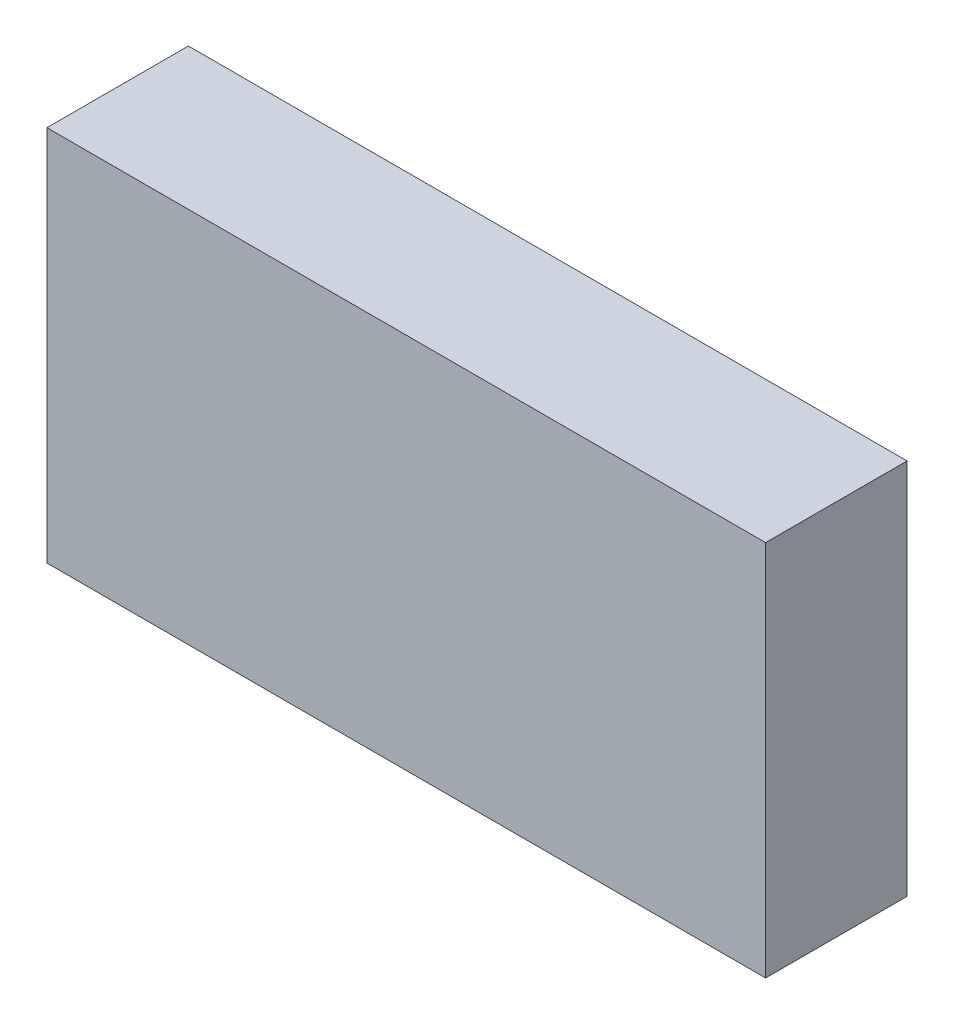
ISO-10303-21;
HEADER;
FILE_DESCRIPTION(('STEP AP214'),'2;1');
FILE_NAME('part.step','',(''),(''),'','','');
FILE_SCHEMA(('AUTOMOTIVE_DESIGN { 1 0 10303 214 1 1 1 1 }'));
ENDSEC;
DATA;
#1=APPLICATION_CONTEXT('core data for automotive mechanical design processes');
#2=APPLICATION_PROTOCOL_DEFINITION('international standard','automotive_design',2000,#1);
#3=PRODUCT_CONTEXT('',#1,'mechanical');
#4=PRODUCT('Part','Part','',(#3));
#5=PRODUCT_RELATED_PRODUCT_CATEGORY('part','',(#4));
#6=PRODUCT_DEFINITION_FORMATION('','',#4);
#7=PRODUCT_DEFINITION_CONTEXT('part definition',#1,'design');
#8=PRODUCT_DEFINITION('design','',#6,#7);
#9=PRODUCT_DEFINITION_SHAPE('','',#8);
#10=(LENGTH_UNIT() NAMED_UNIT(*) SI_UNIT(.MILLI.,.METRE.));
#11=(NAMED_UNIT(*) PLANE_ANGLE_UNIT() SI_UNIT($,.RADIAN.));
#12=(NAMED_UNIT(*) SI_UNIT($,.STERADIAN.) SOLID_ANGLE_UNIT());
#13=UNCERTAINTY_MEASURE_WITH_UNIT(LENGTH_MEASURE(1.E-05),#10,'distance_accuracy_value','');
#14=(GEOMETRIC_REPRESENTATION_CONTEXT(3) GLOBAL_UNCERTAINTY_ASSIGNED_CONTEXT((#13)) GLOBAL_UNIT_ASSIGNED_CONTEXT((#10,
#11,#12)) REPRESENTATION_CONTEXT('',''));
#15=CARTESIAN_POINT('',(0.,0.,0.));
#16=DIRECTION('',(0.,0.,1.));
#17=DIRECTION('',(1.,0.,0.));
#18=AXIS2_PLACEMENT_3D('',#15,#16,#17);
#19=CARTESIAN_POINT('',(0.,0.,20.));
#20=DIRECTION('',(1.,0.,0.));
#21=DIRECTION('',(0.,0.,-1.));
#22=AXIS2_PLACEMENT_3D('',#19,#20,#21);
#23=PLANE('',#22);
#24=DIRECTION('',(0.,-1.,0.));
#25=VECTOR('',#24,1.);
#26=CARTESIAN_POINT('',(0.,0.,0.));
#27=LINE('',#26,#25);
#28=CARTESIAN_POINT('',(0.,53.3,0.));
#29=VERTEX_POINT('',#28);
#30=CARTESIAN_POINT('',(0.,0.,0.));
#31=VERTEX_POINT('',#30);
#32=EDGE_CURVE('E97',#29,#31,#27,.T.);
#33=ORIENTED_EDGE('',*,*,#32,.T.);
#34=DIRECTION('',(0.,0.,-1.));
#35=VECTOR('',#34,1.);
#36=CARTESIAN_POINT('',(0.,0.,20.));
#37=LINE('',#36,#35);
#38=CARTESIAN_POINT('',(0.,0.,20.));
#39=VERTEX_POINT('',#38);
#40=EDGE_CURVE('E11',#39,#31,#37,.T.);
#41=ORIENTED_EDGE('',*,*,#40,.F.);
#42=DIRECTION('',(0.,-1.,0.));
#43=VECTOR('',#42,1.);
#44=CARTESIAN_POINT('',(0.,0.,20.));
#45=LINE('',#44,#43);
#46=CARTESIAN_POINT('',(0.,53.3,20.));
#47=VERTEX_POINT('',#46);
#48=EDGE_CURVE('E85',#47,#39,#45,.T.);
#49=ORIENTED_EDGE('',*,*,#48,.F.);
#50=DIRECTION('',(0.,0.,-1.));
#51=VECTOR('',#50,1.);
#52=CARTESIAN_POINT('',(0.,53.3,20.));
#53=LINE('',#52,#51);
#54=EDGE_CURVE('E93',#47,#29,#53,.T.);
#55=ORIENTED_EDGE('',*,*,#54,.T.);
#56=EDGE_LOOP('',(#33,#41,#49,#55));
#57=FACE_BOUND('',#56,.T.);
#58=ADVANCED_FACE('F34',(#57),#23,.F.);
#59=CARTESIAN_POINT('',(0.,0.,20.));
#60=DIRECTION('',(0.,1.,0.));
#61=DIRECTION('',(0.,0.,1.));
#62=AXIS2_PLACEMENT_3D('',#59,#60,#61);
#63=PLANE('',#62);
#64=DIRECTION('',(1.,0.,0.));
#65=VECTOR('',#64,1.);
#66=CARTESIAN_POINT('',(0.,0.,0.));
#67=LINE('',#66,#65);
#68=CARTESIAN_POINT('',(101.6,0.,0.));
#69=VERTEX_POINT('',#68);
#70=EDGE_CURVE('E89',#31,#69,#67,.T.);
#71=ORIENTED_EDGE('',*,*,#70,.T.);
#72=DIRECTION('',(0.,0.,-1.));
#73=VECTOR('',#72,1.);
#74=CARTESIAN_POINT('',(101.6,0.,20.));
#75=LINE('',#74,#73);
#76=CARTESIAN_POINT('',(101.6,0.,20.));
#77=VERTEX_POINT('',#76);
#78=EDGE_CURVE('E42',#77,#69,#75,.T.);
#79=ORIENTED_EDGE('',*,*,#78,.F.);
#80=DIRECTION('',(1.,0.,0.));
#81=VECTOR('',#80,1.);
#82=CARTESIAN_POINT('',(0.,0.,20.));
#83=LINE('',#82,#81);
#84=EDGE_CURVE('E80',#39,#77,#83,.T.);
#85=ORIENTED_EDGE('',*,*,#84,.F.);
#86=ORIENTED_EDGE('',*,*,#40,.T.);
#87=EDGE_LOOP('',(#71,#79,#85,#86));
#88=FACE_BOUND('',#87,.T.);
#89=ADVANCED_FACE('F88',(#88),#63,.F.);
#90=CARTESIAN_POINT('',(101.6,0.,20.));
#91=DIRECTION('',(-1.,0.,0.));
#92=DIRECTION('',(0.,0.,1.));
#93=AXIS2_PLACEMENT_3D('',#90,#91,#92);
#94=PLANE('',#93);
#95=DIRECTION('',(0.,1.,0.));
#96=VECTOR('',#95,1.);
#97=CARTESIAN_POINT('',(101.6,0.,0.));
#98=LINE('',#97,#96);
#99=CARTESIAN_POINT('',(101.6,53.3,0.));
#100=VERTEX_POINT('',#99);
#101=EDGE_CURVE('E67',#69,#100,#98,.T.);
#102=ORIENTED_EDGE('',*,*,#101,.T.);
#103=DIRECTION('',(0.,0.,-1.));
#104=VECTOR('',#103,1.);
#105=CARTESIAN_POINT('',(101.6,53.3,20.));
#106=LINE('',#105,#104);
#107=CARTESIAN_POINT('',(101.6,53.3,20.));
#108=VERTEX_POINT('',#107);
#109=EDGE_CURVE('E90',#108,#100,#106,.T.);
#110=ORIENTED_EDGE('',*,*,#109,.F.);
#111=DIRECTION('',(0.,1.,0.));
#112=VECTOR('',#111,1.);
#113=CARTESIAN_POINT('',(101.6,0.,20.));
#114=LINE('',#113,#112);
#115=EDGE_CURVE('E83',#77,#108,#114,.T.);
#116=ORIENTED_EDGE('',*,*,#115,.F.);
#117=ORIENTED_EDGE('',*,*,#78,.T.);
#118=EDGE_LOOP('',(#102,#110,#116,#117));
#119=FACE_BOUND('',#118,.T.);
#120=ADVANCED_FACE('F91',(#119),#94,.F.);
#121=CARTESIAN_POINT('',(0.,53.3,20.));
#122=DIRECTION('',(0.,-1.,0.));
#123=DIRECTION('',(0.,0.,-1.));
#124=AXIS2_PLACEMENT_3D('',#121,#122,#123);
#125=PLANE('',#124);
#126=DIRECTION('',(-1.,0.,0.));
#127=VECTOR('',#126,1.);
#128=CARTESIAN_POINT('',(0.,53.3,0.));
#129=LINE('',#128,#127);
#130=EDGE_CURVE('E73',#100,#29,#129,.T.);
#131=ORIENTED_EDGE('',*,*,#130,.T.);
#132=ORIENTED_EDGE('',*,*,#54,.F.);
#133=DIRECTION('',(-1.,0.,0.));
#134=VECTOR('',#133,1.);
#135=CARTESIAN_POINT('',(0.,53.3,20.));
#136=LINE('',#135,#134);
#137=EDGE_CURVE('E50',#108,#47,#136,.T.);
#138=ORIENTED_EDGE('',*,*,#137,.F.);
#139=ORIENTED_EDGE('',*,*,#109,.T.);
#140=EDGE_LOOP('',(#131,#132,#138,#139));
#141=FACE_BOUND('',#140,.T.);
#142=ADVANCED_FACE('F104',(#141),#125,.F.);
#143=CARTESIAN_POINT('',(0.,0.,20.));
#144=DIRECTION('',(0.,0.,-1.));
#145=DIRECTION('',(-1.,0.,0.));
#146=AXIS2_PLACEMENT_3D('',#143,#144,#145);
#147=PLANE('',#146);
#148=ORIENTED_EDGE('',*,*,#48,.T.);
#149=ORIENTED_EDGE('',*,*,#84,.T.);
#150=ORIENTED_EDGE('',*,*,#115,.T.);
#151=ORIENTED_EDGE('',*,*,#137,.T.);
#152=EDGE_LOOP('',(#148,#149,#150,#151));
#153=FACE_BOUND('',#152,.T.);
#154=ADVANCED_FACE('F81',(#153),#147,.F.);
#155=CARTESIAN_POINT('',(0.,0.,0.));
#156=DIRECTION('',(0.,0.,-1.));
#157=DIRECTION('',(-1.,0.,0.));
#158=AXIS2_PLACEMENT_3D('',#155,#156,#157);
#159=PLANE('',#158);
#160=ORIENTED_EDGE('',*,*,#32,.F.);
#161=ORIENTED_EDGE('',*,*,#130,.F.);
#162=ORIENTED_EDGE('',*,*,#101,.F.);
#163=ORIENTED_EDGE('',*,*,#70,.F.);
#164=EDGE_LOOP('',(#160,#161,#162,#163));
#165=FACE_BOUND('',#164,.T.);
#166=ADVANCED_FACE('F107',(#165),#159,.T.);
#167=CLOSED_SHELL('',(#58,#89,#120,#142,#154,#166));
#168=MANIFOLD_SOLID_BREP('B2',#167);
#169=ADVANCED_BREP_SHAPE_REPRESENTATION('',(#18,#168),#14);
#170=SHAPE_DEFINITION_REPRESENTATION(#9,#169);
ENDSEC;
END-ISO-10303-21;
